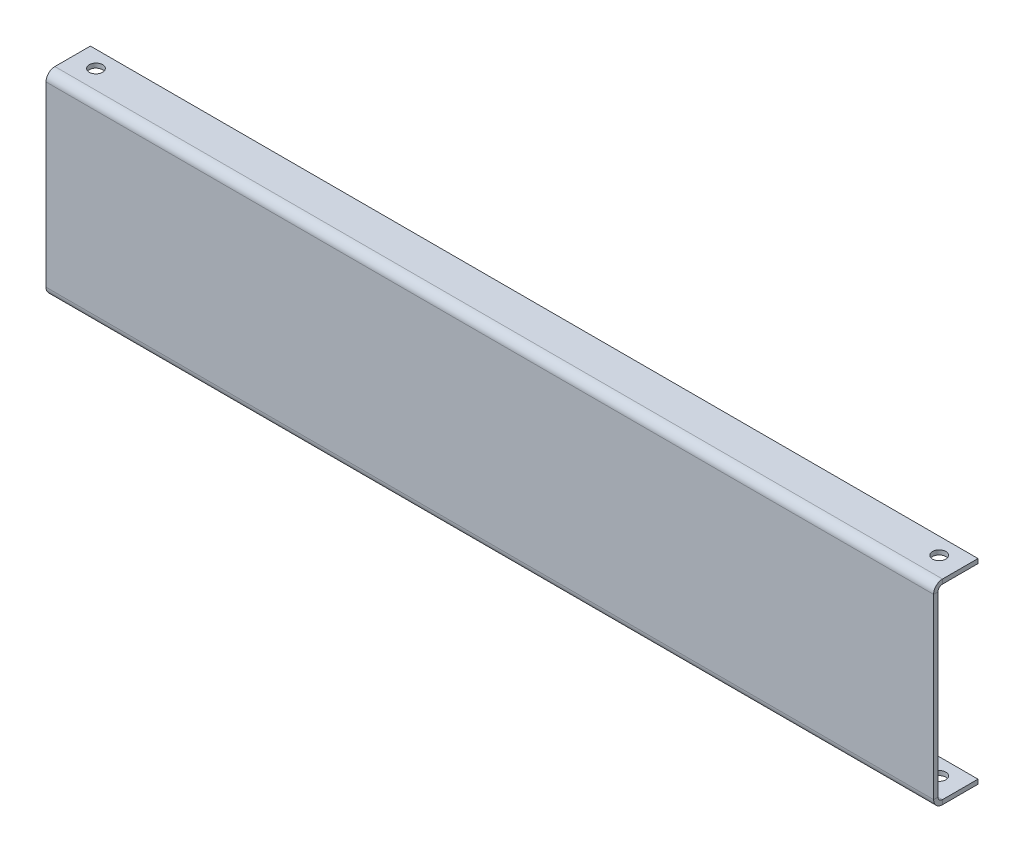
ISO-10303-21;
HEADER;
FILE_DESCRIPTION(('STEP AP214'),'2;1');
FILE_NAME('part.step','',(''),(''),'','','');
FILE_SCHEMA(('AUTOMOTIVE_DESIGN { 1 0 10303 214 1 1 1 1 }'));
ENDSEC;
DATA;
#1=APPLICATION_CONTEXT('core data for automotive mechanical design processes');
#2=APPLICATION_PROTOCOL_DEFINITION('international standard','automotive_design',2000,#1);
#3=PRODUCT_CONTEXT('',#1,'mechanical');
#4=PRODUCT('Part','Part','',(#3));
#5=PRODUCT_RELATED_PRODUCT_CATEGORY('part','',(#4));
#6=PRODUCT_DEFINITION_FORMATION('','',#4);
#7=PRODUCT_DEFINITION_CONTEXT('part definition',#1,'design');
#8=PRODUCT_DEFINITION('design','',#6,#7);
#9=PRODUCT_DEFINITION_SHAPE('','',#8);
#10=(LENGTH_UNIT() NAMED_UNIT(*) SI_UNIT(.MILLI.,.METRE.));
#11=(NAMED_UNIT(*) PLANE_ANGLE_UNIT() SI_UNIT($,.RADIAN.));
#12=(NAMED_UNIT(*) SI_UNIT($,.STERADIAN.) SOLID_ANGLE_UNIT());
#13=UNCERTAINTY_MEASURE_WITH_UNIT(LENGTH_MEASURE(1.E-05),#10,'distance_accuracy_value','');
#14=(GEOMETRIC_REPRESENTATION_CONTEXT(3) GLOBAL_UNCERTAINTY_ASSIGNED_CONTEXT((#13)) GLOBAL_UNIT_ASSIGNED_CONTEXT((#10,
#11,#12)) REPRESENTATION_CONTEXT('',''));
#15=CARTESIAN_POINT('',(0.,0.,0.));
#16=DIRECTION('',(0.,0.,1.));
#17=DIRECTION('',(1.,0.,0.));
#18=AXIS2_PLACEMENT_3D('',#15,#16,#17);
#19=CARTESIAN_POINT('',(400.,0.,16.));
#20=DIRECTION('',(1.,0.,0.));
#21=DIRECTION('',(0.,0.,-1.));
#22=AXIS2_PLACEMENT_3D('',#19,#20,#21);
#23=PLANE('',#22);
#24=DIRECTION('',(0.,-1.,0.));
#25=VECTOR('',#24,1.);
#26=CARTESIAN_POINT('',(400.,0.,16.));
#27=LINE('',#26,#25);
#28=CARTESIAN_POINT('',(400.,0.,16.));
#29=VERTEX_POINT('',#28);
#30=CARTESIAN_POINT('',(400.,-2.,16.));
#31=VERTEX_POINT('',#30);
#32=EDGE_CURVE('E11',#29,#31,#27,.T.);
#33=ORIENTED_EDGE('',*,*,#32,.F.);
#34=CARTESIAN_POINT('',(400.,-4.,16.));
#35=DIRECTION('',(-1.,0.,0.));
#36=DIRECTION('',(0.,0.,1.));
#37=AXIS2_PLACEMENT_3D('',#34,#35,#36);
#38=CIRCLE('',#37,4.);
#39=CARTESIAN_POINT('',(400.,-4.,20.));
#40=VERTEX_POINT('',#39);
#41=EDGE_CURVE('E149',#29,#40,#38,.F.);
#42=ORIENTED_EDGE('',*,*,#41,.T.);
#43=DIRECTION('',(0.,0.,1.));
#44=VECTOR('',#43,1.);
#45=CARTESIAN_POINT('',(400.,-4.,18.));
#46=LINE('',#45,#44);
#47=CARTESIAN_POINT('',(400.,-4.,18.));
#48=VERTEX_POINT('',#47);
#49=EDGE_CURVE('E47',#48,#40,#46,.T.);
#50=ORIENTED_EDGE('',*,*,#49,.F.);
#51=CARTESIAN_POINT('',(400.,-4.,16.));
#52=DIRECTION('',(1.,0.,0.));
#53=DIRECTION('',(0.,0.,-1.));
#54=AXIS2_PLACEMENT_3D('',#51,#52,#53);
#55=CIRCLE('',#54,2.);
#56=EDGE_CURVE('E244',#31,#48,#55,.T.);
#57=ORIENTED_EDGE('',*,*,#56,.F.);
#58=EDGE_LOOP('',(#33,#42,#50,#57));
#59=FACE_BOUND('',#58,.T.);
#60=ADVANCED_FACE('F39',(#59),#23,.T.);
#61=CARTESIAN_POINT('',(400.,-4.,18.));
#62=DIRECTION('',(1.,0.,0.));
#63=DIRECTION('',(0.,0.,-1.));
#64=AXIS2_PLACEMENT_3D('',#61,#62,#63);
#65=PLANE('',#64);
#66=DIRECTION('',(0.,0.,1.));
#67=VECTOR('',#66,1.);
#68=CARTESIAN_POINT('',(400.,0.,0.));
#69=LINE('',#68,#67);
#70=CARTESIAN_POINT('',(400.,0.,0.));
#71=VERTEX_POINT('',#70);
#72=EDGE_CURVE('E154',#71,#29,#69,.T.);
#73=ORIENTED_EDGE('',*,*,#72,.T.);
#74=ORIENTED_EDGE('',*,*,#32,.T.);
#75=DIRECTION('',(0.,0.,1.));
#76=VECTOR('',#75,1.);
#77=CARTESIAN_POINT('',(400.,-2.,0.));
#78=LINE('',#77,#76);
#79=CARTESIAN_POINT('',(400.,-2.,0.));
#80=VERTEX_POINT('',#79);
#81=EDGE_CURVE('E257',#80,#31,#78,.T.);
#82=ORIENTED_EDGE('',*,*,#81,.F.);
#83=DIRECTION('',(0.,-1.,0.));
#84=VECTOR('',#83,1.);
#85=CARTESIAN_POINT('',(400.,0.,0.));
#86=LINE('',#85,#84);
#87=EDGE_CURVE('E259',#71,#80,#86,.T.);
#88=ORIENTED_EDGE('',*,*,#87,.F.);
#89=EDGE_LOOP('',(#73,#74,#82,#88));
#90=FACE_BOUND('',#89,.T.);
#91=ADVANCED_FACE('F270',(#90),#65,.T.);
#92=CARTESIAN_POINT('',(0.,-4.,20.));
#93=DIRECTION('',(-1.,0.,0.));
#94=DIRECTION('',(0.,0.,1.));
#95=AXIS2_PLACEMENT_3D('',#92,#93,#94);
#96=PLANE('',#95);
#97=DIRECTION('',(0.,0.,-1.));
#98=VECTOR('',#97,1.);
#99=CARTESIAN_POINT('',(0.,-4.,20.));
#100=LINE('',#99,#98);
#101=CARTESIAN_POINT('',(0.,-4.,20.));
#102=VERTEX_POINT('',#101);
#103=CARTESIAN_POINT('',(0.,-4.,18.));
#104=VERTEX_POINT('',#103);
#105=EDGE_CURVE('E147',#102,#104,#100,.T.);
#106=ORIENTED_EDGE('',*,*,#105,.F.);
#107=CARTESIAN_POINT('',(0.,-4.,16.));
#108=DIRECTION('',(-1.,0.,0.));
#109=DIRECTION('',(0.,0.,1.));
#110=AXIS2_PLACEMENT_3D('',#107,#108,#109);
#111=CIRCLE('',#110,4.);
#112=CARTESIAN_POINT('',(0.,0.,16.));
#113=VERTEX_POINT('',#112);
#114=EDGE_CURVE('E161',#113,#102,#111,.F.);
#115=ORIENTED_EDGE('',*,*,#114,.F.);
#116=DIRECTION('',(0.,1.,0.));
#117=VECTOR('',#116,1.);
#118=CARTESIAN_POINT('',(0.,-2.,16.));
#119=LINE('',#118,#117);
#120=CARTESIAN_POINT('',(0.,-2.,16.));
#121=VERTEX_POINT('',#120);
#122=EDGE_CURVE('E235',#121,#113,#119,.T.);
#123=ORIENTED_EDGE('',*,*,#122,.F.);
#124=CARTESIAN_POINT('',(0.,-4.,16.));
#125=DIRECTION('',(1.,0.,0.));
#126=DIRECTION('',(0.,0.,-1.));
#127=AXIS2_PLACEMENT_3D('',#124,#125,#126);
#128=CIRCLE('',#127,2.);
#129=EDGE_CURVE('E189',#121,#104,#128,.T.);
#130=ORIENTED_EDGE('',*,*,#129,.T.);
#131=EDGE_LOOP('',(#106,#115,#123,#130));
#132=FACE_BOUND('',#131,.T.);
#133=ADVANCED_FACE('F249',(#132),#96,.T.);
#134=CARTESIAN_POINT('',(0.,-2.,16.));
#135=DIRECTION('',(-1.,0.,0.));
#136=DIRECTION('',(0.,0.,1.));
#137=AXIS2_PLACEMENT_3D('',#134,#135,#136);
#138=PLANE('',#137);
#139=DIRECTION('',(0.,-1.,0.));
#140=VECTOR('',#139,1.);
#141=CARTESIAN_POINT('',(0.,0.,20.));
#142=LINE('',#141,#140);
#143=CARTESIAN_POINT('',(0.,-84.1,20.));
#144=VERTEX_POINT('',#143);
#145=EDGE_CURVE('E202',#102,#144,#142,.T.);
#146=ORIENTED_EDGE('',*,*,#145,.F.);
#147=ORIENTED_EDGE('',*,*,#105,.T.);
#148=DIRECTION('',(0.,-1.,0.));
#149=VECTOR('',#148,1.);
#150=CARTESIAN_POINT('',(0.,0.,18.));
#151=LINE('',#150,#149);
#152=CARTESIAN_POINT('',(0.,-84.1,18.));
#153=VERTEX_POINT('',#152);
#154=EDGE_CURVE('E187',#104,#153,#151,.T.);
#155=ORIENTED_EDGE('',*,*,#154,.T.);
#156=DIRECTION('',(0.,0.,1.));
#157=VECTOR('',#156,1.);
#158=CARTESIAN_POINT('',(0.,-84.1,18.));
#159=LINE('',#158,#157);
#160=EDGE_CURVE('E96',#153,#144,#159,.T.);
#161=ORIENTED_EDGE('',*,*,#160,.T.);
#162=EDGE_LOOP('',(#146,#147,#155,#161));
#163=FACE_BOUND('',#162,.T.);
#164=ADVANCED_FACE('F237',(#163),#138,.T.);
#165=CARTESIAN_POINT('',(400.,-84.1,20.));
#166=DIRECTION('',(1.,0.,0.));
#167=DIRECTION('',(0.,0.,-1.));
#168=AXIS2_PLACEMENT_3D('',#165,#166,#167);
#169=PLANE('',#168);
#170=DIRECTION('',(0.,0.,-1.));
#171=VECTOR('',#170,1.);
#172=CARTESIAN_POINT('',(400.,-84.1,20.));
#173=LINE('',#172,#171);
#174=CARTESIAN_POINT('',(400.,-84.1,20.));
#175=VERTEX_POINT('',#174);
#176=CARTESIAN_POINT('',(400.,-84.1,18.));
#177=VERTEX_POINT('',#176);
#178=EDGE_CURVE('E233',#175,#177,#173,.T.);
#179=ORIENTED_EDGE('',*,*,#178,.F.);
#180=CARTESIAN_POINT('',(400.,-84.1,16.));
#181=DIRECTION('',(-1.,0.,0.));
#182=DIRECTION('',(0.,0.,1.));
#183=AXIS2_PLACEMENT_3D('',#180,#181,#182);
#184=CIRCLE('',#183,4.);
#185=CARTESIAN_POINT('',(400.,-88.1,16.));
#186=VERTEX_POINT('',#185);
#187=EDGE_CURVE('E169',#175,#186,#184,.F.);
#188=ORIENTED_EDGE('',*,*,#187,.T.);
#189=DIRECTION('',(0.,-1.,0.));
#190=VECTOR('',#189,1.);
#191=CARTESIAN_POINT('',(400.,-86.1,16.));
#192=LINE('',#191,#190);
#193=CARTESIAN_POINT('',(400.,-86.1,16.));
#194=VERTEX_POINT('',#193);
#195=EDGE_CURVE('E55',#194,#186,#192,.T.);
#196=ORIENTED_EDGE('',*,*,#195,.F.);
#197=CARTESIAN_POINT('',(400.,-84.1,16.));
#198=DIRECTION('',(1.,0.,0.));
#199=DIRECTION('',(0.,0.,-1.));
#200=AXIS2_PLACEMENT_3D('',#197,#198,#199);
#201=CIRCLE('',#200,2.);
#202=EDGE_CURVE('E261',#177,#194,#201,.T.);
#203=ORIENTED_EDGE('',*,*,#202,.F.);
#204=EDGE_LOOP('',(#179,#188,#196,#203));
#205=FACE_BOUND('',#204,.T.);
#206=ADVANCED_FACE('F298',(#205),#169,.T.);
#207=CARTESIAN_POINT('',(400.,-86.1,16.));
#208=DIRECTION('',(1.,0.,0.));
#209=DIRECTION('',(0.,0.,-1.));
#210=AXIS2_PLACEMENT_3D('',#207,#208,#209);
#211=PLANE('',#210);
#212=DIRECTION('',(0.,-1.,0.));
#213=VECTOR('',#212,1.);
#214=CARTESIAN_POINT('',(400.,0.,20.));
#215=LINE('',#214,#213);
#216=EDGE_CURVE('E139',#40,#175,#215,.T.);
#217=ORIENTED_EDGE('',*,*,#216,.T.);
#218=ORIENTED_EDGE('',*,*,#178,.T.);
#219=DIRECTION('',(0.,-1.,0.));
#220=VECTOR('',#219,1.);
#221=CARTESIAN_POINT('',(400.,0.,18.));
#222=LINE('',#221,#220);
#223=EDGE_CURVE('E142',#48,#177,#222,.T.);
#224=ORIENTED_EDGE('',*,*,#223,.F.);
#225=ORIENTED_EDGE('',*,*,#49,.T.);
#226=EDGE_LOOP('',(#217,#218,#224,#225));
#227=FACE_BOUND('',#226,.T.);
#228=ADVANCED_FACE('F137',(#227),#211,.T.);
#229=CARTESIAN_POINT('',(0.,-88.1,16.));
#230=DIRECTION('',(-1.,0.,0.));
#231=DIRECTION('',(0.,0.,1.));
#232=AXIS2_PLACEMENT_3D('',#229,#230,#231);
#233=PLANE('',#232);
#234=DIRECTION('',(0.,1.,0.));
#235=VECTOR('',#234,1.);
#236=CARTESIAN_POINT('',(0.,-88.1,16.));
#237=LINE('',#236,#235);
#238=CARTESIAN_POINT('',(0.,-88.1,16.));
#239=VERTEX_POINT('',#238);
#240=CARTESIAN_POINT('',(0.,-86.1,16.));
#241=VERTEX_POINT('',#240);
#242=EDGE_CURVE('E103',#239,#241,#237,.T.);
#243=ORIENTED_EDGE('',*,*,#242,.F.);
#244=CARTESIAN_POINT('',(0.,-84.1,16.));
#245=DIRECTION('',(-1.,0.,0.));
#246=DIRECTION('',(0.,0.,1.));
#247=AXIS2_PLACEMENT_3D('',#244,#245,#246);
#248=CIRCLE('',#247,4.);
#249=EDGE_CURVE('E204',#144,#239,#248,.F.);
#250=ORIENTED_EDGE('',*,*,#249,.F.);
#251=ORIENTED_EDGE('',*,*,#160,.F.);
#252=CARTESIAN_POINT('',(0.,-84.1,16.));
#253=DIRECTION('',(1.,0.,0.));
#254=DIRECTION('',(0.,0.,-1.));
#255=AXIS2_PLACEMENT_3D('',#252,#253,#254);
#256=CIRCLE('',#255,2.);
#257=EDGE_CURVE('E185',#153,#241,#256,.T.);
#258=ORIENTED_EDGE('',*,*,#257,.T.);
#259=EDGE_LOOP('',(#243,#250,#251,#258));
#260=FACE_BOUND('',#259,.T.);
#261=ADVANCED_FACE('F304',(#260),#233,.T.);
#262=CARTESIAN_POINT('',(0.,-84.1,18.));
#263=DIRECTION('',(-1.,0.,0.));
#264=DIRECTION('',(0.,0.,1.));
#265=AXIS2_PLACEMENT_3D('',#262,#263,#264);
#266=PLANE('',#265);
#267=DIRECTION('',(0.,0.,-1.));
#268=VECTOR('',#267,1.);
#269=CARTESIAN_POINT('',(0.,-88.1,20.));
#270=LINE('',#269,#268);
#271=CARTESIAN_POINT('',(0.,-88.1,0.));
#272=VERTEX_POINT('',#271);
#273=EDGE_CURVE('E175',#239,#272,#270,.T.);
#274=ORIENTED_EDGE('',*,*,#273,.F.);
#275=ORIENTED_EDGE('',*,*,#242,.T.);
#276=DIRECTION('',(0.,0.,-1.));
#277=VECTOR('',#276,1.);
#278=CARTESIAN_POINT('',(0.,-86.1,20.));
#279=LINE('',#278,#277);
#280=CARTESIAN_POINT('',(0.,-86.1,0.));
#281=VERTEX_POINT('',#280);
#282=EDGE_CURVE('E182',#241,#281,#279,.T.);
#283=ORIENTED_EDGE('',*,*,#282,.T.);
#284=DIRECTION('',(0.,-1.,0.));
#285=VECTOR('',#284,1.);
#286=CARTESIAN_POINT('',(0.,-86.1,0.));
#287=LINE('',#286,#285);
#288=EDGE_CURVE('E178',#281,#272,#287,.T.);
#289=ORIENTED_EDGE('',*,*,#288,.T.);
#290=EDGE_LOOP('',(#274,#275,#283,#289));
#291=FACE_BOUND('',#290,.T.);
#292=ADVANCED_FACE('F307',(#291),#266,.T.);
#293=CARTESIAN_POINT('',(400.,-88.1,20.));
#294=DIRECTION('',(0.,1.,0.));
#295=DIRECTION('',(0.,0.,1.));
#296=AXIS2_PLACEMENT_3D('',#293,#294,#295);
#297=PLANE('',#296);
#298=CARTESIAN_POINT('',(10.,-88.1,7.49999999999999));
#299=DIRECTION('',(0.,1.,0.));
#300=DIRECTION('',(0.,0.,1.));
#301=AXIS2_PLACEMENT_3D('',#298,#299,#300);
#302=CIRCLE('',#301,3.);
#303=CARTESIAN_POINT('',(10.,-88.1,10.5));
#304=VERTEX_POINT('',#303);
#305=EDGE_CURVE('E593',#304,#304,#302,.T.);
#306=ORIENTED_EDGE('',*,*,#305,.T.);
#307=EDGE_LOOP('',(#306));
#308=FACE_BOUND('',#307,.T.);
#309=CARTESIAN_POINT('',(390.,-88.1,7.49999999999999));
#310=DIRECTION('',(0.,1.,0.));
#311=DIRECTION('',(0.,0.,1.));
#312=AXIS2_PLACEMENT_3D('',#309,#310,#311);
#313=CIRCLE('',#312,2.99999999999999);
#314=CARTESIAN_POINT('',(390.,-88.1,10.5));
#315=VERTEX_POINT('',#314);
#316=EDGE_CURVE('E581',#315,#315,#313,.T.);
#317=ORIENTED_EDGE('',*,*,#316,.T.);
#318=EDGE_LOOP('',(#317));
#319=FACE_BOUND('',#318,.T.);
#320=ORIENTED_EDGE('',*,*,#273,.T.);
#321=DIRECTION('',(-1.,0.,0.));
#322=VECTOR('',#321,1.);
#323=CARTESIAN_POINT('',(400.,-88.1,0.));
#324=LINE('',#323,#322);
#325=CARTESIAN_POINT('',(400.,-88.1,0.));
#326=VERTEX_POINT('',#325);
#327=EDGE_CURVE('E228',#326,#272,#324,.T.);
#328=ORIENTED_EDGE('',*,*,#327,.F.);
#329=DIRECTION('',(0.,0.,-1.));
#330=VECTOR('',#329,1.);
#331=CARTESIAN_POINT('',(400.,-88.1,20.));
#332=LINE('',#331,#330);
#333=EDGE_CURVE('E109',#186,#326,#332,.T.);
#334=ORIENTED_EDGE('',*,*,#333,.F.);
#335=DIRECTION('',(-1.,0.,0.));
#336=VECTOR('',#335,1.);
#337=CARTESIAN_POINT('',(400.,-88.1,16.));
#338=LINE('',#337,#336);
#339=EDGE_CURVE('E171',#186,#239,#338,.T.);
#340=ORIENTED_EDGE('',*,*,#339,.T.);
#341=EDGE_LOOP('',(#320,#328,#334,#340));
#342=FACE_BOUND('',#341,.T.);
#343=ADVANCED_FACE('F310',(#308,#319,#342),#297,.F.);
#344=CARTESIAN_POINT('',(400.,-86.1,0.));
#345=DIRECTION('',(0.,0.,-1.));
#346=DIRECTION('',(-1.,0.,0.));
#347=AXIS2_PLACEMENT_3D('',#344,#345,#346);
#348=PLANE('',#347);
#349=ORIENTED_EDGE('',*,*,#288,.F.);
#350=DIRECTION('',(-1.,0.,0.));
#351=VECTOR('',#350,1.);
#352=CARTESIAN_POINT('',(400.,-86.1,0.));
#353=LINE('',#352,#351);
#354=CARTESIAN_POINT('',(400.,-86.1,0.));
#355=VERTEX_POINT('',#354);
#356=EDGE_CURVE('E226',#355,#281,#353,.T.);
#357=ORIENTED_EDGE('',*,*,#356,.F.);
#358=DIRECTION('',(0.,-1.,0.));
#359=VECTOR('',#358,1.);
#360=CARTESIAN_POINT('',(400.,-86.1,0.));
#361=LINE('',#360,#359);
#362=EDGE_CURVE('E565',#355,#326,#361,.T.);
#363=ORIENTED_EDGE('',*,*,#362,.T.);
#364=ORIENTED_EDGE('',*,*,#327,.T.);
#365=EDGE_LOOP('',(#349,#357,#363,#364));
#366=FACE_BOUND('',#365,.T.);
#367=ADVANCED_FACE('F314',(#366),#348,.T.);
#368=CARTESIAN_POINT('',(400.,-86.1,20.));
#369=DIRECTION('',(0.,1.,0.));
#370=DIRECTION('',(0.,0.,1.));
#371=AXIS2_PLACEMENT_3D('',#368,#369,#370);
#372=PLANE('',#371);
#373=CARTESIAN_POINT('',(10.,-86.1,7.49999999999999));
#374=DIRECTION('',(0.,1.,0.));
#375=DIRECTION('',(0.,0.,1.));
#376=AXIS2_PLACEMENT_3D('',#373,#374,#375);
#377=CIRCLE('',#376,3.);
#378=CARTESIAN_POINT('',(10.,-86.1,10.5));
#379=VERTEX_POINT('',#378);
#380=EDGE_CURVE('E585',#379,#379,#377,.T.);
#381=ORIENTED_EDGE('',*,*,#380,.F.);
#382=EDGE_LOOP('',(#381));
#383=FACE_BOUND('',#382,.T.);
#384=CARTESIAN_POINT('',(390.,-86.1,7.49999999999999));
#385=DIRECTION('',(0.,1.,0.));
#386=DIRECTION('',(0.,0.,1.));
#387=AXIS2_PLACEMENT_3D('',#384,#385,#386);
#388=CIRCLE('',#387,2.99999999999999);
#389=CARTESIAN_POINT('',(390.,-86.1,10.5));
#390=VERTEX_POINT('',#389);
#391=EDGE_CURVE('E179',#390,#390,#388,.T.);
#392=ORIENTED_EDGE('',*,*,#391,.F.);
#393=EDGE_LOOP('',(#392));
#394=FACE_BOUND('',#393,.T.);
#395=ORIENTED_EDGE('',*,*,#282,.F.);
#396=DIRECTION('',(-1.,0.,0.));
#397=VECTOR('',#396,1.);
#398=CARTESIAN_POINT('',(400.,-86.1,16.));
#399=LINE('',#398,#397);
#400=EDGE_CURVE('E223',#194,#241,#399,.T.);
#401=ORIENTED_EDGE('',*,*,#400,.F.);
#402=DIRECTION('',(0.,0.,-1.));
#403=VECTOR('',#402,1.);
#404=CARTESIAN_POINT('',(400.,-86.1,20.));
#405=LINE('',#404,#403);
#406=EDGE_CURVE('E567',#194,#355,#405,.T.);
#407=ORIENTED_EDGE('',*,*,#406,.T.);
#408=ORIENTED_EDGE('',*,*,#356,.T.);
#409=EDGE_LOOP('',(#395,#401,#407,#408));
#410=FACE_BOUND('',#409,.T.);
#411=ADVANCED_FACE('F318',(#383,#394,#410),#372,.T.);
#412=CARTESIAN_POINT('',(400.,-84.1,16.));
#413=DIRECTION('',(-1.,0.,0.));
#414=DIRECTION('',(0.,0.,1.));
#415=AXIS2_PLACEMENT_3D('',#412,#413,#414);
#416=CYLINDRICAL_SURFACE('',#415,2.);
#417=ORIENTED_EDGE('',*,*,#257,.F.);
#418=DIRECTION('',(-1.,0.,0.));
#419=VECTOR('',#418,1.);
#420=CARTESIAN_POINT('',(400.,-84.1,18.));
#421=LINE('',#420,#419);
#422=EDGE_CURVE('E220',#177,#153,#421,.T.);
#423=ORIENTED_EDGE('',*,*,#422,.F.);
#424=ORIENTED_EDGE('',*,*,#202,.T.);
#425=ORIENTED_EDGE('',*,*,#400,.T.);
#426=EDGE_LOOP('',(#417,#423,#424,#425));
#427=FACE_BOUND('',#426,.T.);
#428=ADVANCED_FACE('F322',(#427),#416,.F.);
#429=CARTESIAN_POINT('',(400.,0.,18.));
#430=DIRECTION('',(0.,0.,-1.));
#431=DIRECTION('',(0.,1.,0.));
#432=AXIS2_PLACEMENT_3D('',#429,#430,#431);
#433=PLANE('',#432);
#434=ORIENTED_EDGE('',*,*,#154,.F.);
#435=DIRECTION('',(-1.,0.,0.));
#436=VECTOR('',#435,1.);
#437=CARTESIAN_POINT('',(400.,-4.,18.));
#438=LINE('',#437,#436);
#439=EDGE_CURVE('E217',#48,#104,#438,.T.);
#440=ORIENTED_EDGE('',*,*,#439,.F.);
#441=ORIENTED_EDGE('',*,*,#223,.T.);
#442=ORIENTED_EDGE('',*,*,#422,.T.);
#443=EDGE_LOOP('',(#434,#440,#441,#442));
#444=FACE_BOUND('',#443,.T.);
#445=ADVANCED_FACE('F246',(#444),#433,.T.);
#446=CARTESIAN_POINT('',(400.,-4.,16.));
#447=DIRECTION('',(-1.,0.,0.));
#448=DIRECTION('',(0.,0.,1.));
#449=AXIS2_PLACEMENT_3D('',#446,#447,#448);
#450=CYLINDRICAL_SURFACE('',#449,2.);
#451=ORIENTED_EDGE('',*,*,#129,.F.);
#452=DIRECTION('',(-1.,0.,0.));
#453=VECTOR('',#452,1.);
#454=CARTESIAN_POINT('',(400.,-2.,16.));
#455=LINE('',#454,#453);
#456=EDGE_CURVE('E214',#31,#121,#455,.T.);
#457=ORIENTED_EDGE('',*,*,#456,.F.);
#458=ORIENTED_EDGE('',*,*,#56,.T.);
#459=ORIENTED_EDGE('',*,*,#439,.T.);
#460=EDGE_LOOP('',(#451,#457,#458,#459));
#461=FACE_BOUND('',#460,.T.);
#462=ADVANCED_FACE('F242',(#461),#450,.F.);
#463=CARTESIAN_POINT('',(400.,-2.,0.));
#464=DIRECTION('',(0.,-1.,0.));
#465=DIRECTION('',(0.,0.,-1.));
#466=AXIS2_PLACEMENT_3D('',#463,#464,#465);
#467=PLANE('',#466);
#468=CARTESIAN_POINT('',(10.,-2.,7.5));
#469=DIRECTION('',(0.,-1.,0.));
#470=DIRECTION('',(0.,0.,-1.));
#471=AXIS2_PLACEMENT_3D('',#468,#469,#470);
#472=CIRCLE('',#471,3.);
#473=CARTESIAN_POINT('',(10.,-2.,4.5));
#474=VERTEX_POINT('',#473);
#475=EDGE_CURVE('E590',#474,#474,#472,.T.);
#476=ORIENTED_EDGE('',*,*,#475,.F.);
#477=EDGE_LOOP('',(#476));
#478=FACE_BOUND('',#477,.T.);
#479=CARTESIAN_POINT('',(390.,-2.,7.5));
#480=DIRECTION('',(0.,-1.,0.));
#481=DIRECTION('',(0.,0.,-1.));
#482=AXIS2_PLACEMENT_3D('',#479,#480,#481);
#483=CIRCLE('',#482,2.99999999999999);
#484=CARTESIAN_POINT('',(390.,-2.,4.50000000000001));
#485=VERTEX_POINT('',#484);
#486=EDGE_CURVE('E578',#485,#485,#483,.T.);
#487=ORIENTED_EDGE('',*,*,#486,.F.);
#488=EDGE_LOOP('',(#487));
#489=FACE_BOUND('',#488,.T.);
#490=DIRECTION('',(0.,0.,1.));
#491=VECTOR('',#490,1.);
#492=CARTESIAN_POINT('',(0.,-2.,0.));
#493=LINE('',#492,#491);
#494=CARTESIAN_POINT('',(0.,-2.,0.));
#495=VERTEX_POINT('',#494);
#496=EDGE_CURVE('E192',#495,#121,#493,.T.);
#497=ORIENTED_EDGE('',*,*,#496,.F.);
#498=DIRECTION('',(-1.,0.,0.));
#499=VECTOR('',#498,1.);
#500=CARTESIAN_POINT('',(400.,-2.,0.));
#501=LINE('',#500,#499);
#502=EDGE_CURVE('E212',#80,#495,#501,.T.);
#503=ORIENTED_EDGE('',*,*,#502,.F.);
#504=ORIENTED_EDGE('',*,*,#81,.T.);
#505=ORIENTED_EDGE('',*,*,#456,.T.);
#506=EDGE_LOOP('',(#497,#503,#504,#505));
#507=FACE_BOUND('',#506,.T.);
#508=ADVANCED_FACE('F255',(#478,#489,#507),#467,.T.);
#509=CARTESIAN_POINT('',(400.,0.,0.));
#510=DIRECTION('',(0.,0.,-1.));
#511=DIRECTION('',(0.,1.,0.));
#512=AXIS2_PLACEMENT_3D('',#509,#510,#511);
#513=PLANE('',#512);
#514=DIRECTION('',(0.,-1.,0.));
#515=VECTOR('',#514,1.);
#516=CARTESIAN_POINT('',(0.,0.,0.));
#517=LINE('',#516,#515);
#518=CARTESIAN_POINT('',(0.,0.,0.));
#519=VERTEX_POINT('',#518);
#520=EDGE_CURVE('E195',#519,#495,#517,.T.);
#521=ORIENTED_EDGE('',*,*,#520,.F.);
#522=DIRECTION('',(-1.,0.,0.));
#523=VECTOR('',#522,1.);
#524=CARTESIAN_POINT('',(400.,0.,0.));
#525=LINE('',#524,#523);
#526=EDGE_CURVE('E210',#71,#519,#525,.T.);
#527=ORIENTED_EDGE('',*,*,#526,.F.);
#528=ORIENTED_EDGE('',*,*,#87,.T.);
#529=ORIENTED_EDGE('',*,*,#502,.T.);
#530=EDGE_LOOP('',(#521,#527,#528,#529));
#531=FACE_BOUND('',#530,.T.);
#532=ADVANCED_FACE('F276',(#531),#513,.T.);
#533=CARTESIAN_POINT('',(400.,0.,0.));
#534=DIRECTION('',(0.,-1.,0.));
#535=DIRECTION('',(0.,0.,-1.));
#536=AXIS2_PLACEMENT_3D('',#533,#534,#535);
#537=PLANE('',#536);
#538=CARTESIAN_POINT('',(10.,0.,7.5));
#539=DIRECTION('',(0.,1.,0.));
#540=DIRECTION('',(0.,0.,1.));
#541=AXIS2_PLACEMENT_3D('',#538,#539,#540);
#542=CIRCLE('',#541,3.);
#543=CARTESIAN_POINT('',(10.,0.,10.5));
#544=VERTEX_POINT('',#543);
#545=EDGE_CURVE('E594',#544,#544,#542,.T.);
#546=ORIENTED_EDGE('',*,*,#545,.F.);
#547=EDGE_LOOP('',(#546));
#548=FACE_BOUND('',#547,.T.);
#549=CARTESIAN_POINT('',(390.,0.,7.5));
#550=DIRECTION('',(0.,1.,0.));
#551=DIRECTION('',(0.,0.,1.));
#552=AXIS2_PLACEMENT_3D('',#549,#550,#551);
#553=CIRCLE('',#552,2.99999999999999);
#554=CARTESIAN_POINT('',(390.,0.,10.5));
#555=VERTEX_POINT('',#554);
#556=EDGE_CURVE('E582',#555,#555,#553,.T.);
#557=ORIENTED_EDGE('',*,*,#556,.F.);
#558=EDGE_LOOP('',(#557));
#559=FACE_BOUND('',#558,.T.);
#560=DIRECTION('',(0.,0.,1.));
#561=VECTOR('',#560,1.);
#562=CARTESIAN_POINT('',(0.,0.,0.));
#563=LINE('',#562,#561);
#564=EDGE_CURVE('E198',#519,#113,#563,.T.);
#565=ORIENTED_EDGE('',*,*,#564,.T.);
#566=DIRECTION('',(-1.,0.,0.));
#567=VECTOR('',#566,1.);
#568=CARTESIAN_POINT('',(400.,0.,16.));
#569=LINE('',#568,#567);
#570=EDGE_CURVE('E163',#29,#113,#569,.T.);
#571=ORIENTED_EDGE('',*,*,#570,.F.);
#572=ORIENTED_EDGE('',*,*,#72,.F.);
#573=ORIENTED_EDGE('',*,*,#526,.T.);
#574=EDGE_LOOP('',(#565,#571,#572,#573));
#575=FACE_BOUND('',#574,.T.);
#576=ADVANCED_FACE('F272',(#548,#559,#575),#537,.F.);
#577=CARTESIAN_POINT('',(400.,-4.,16.));
#578=DIRECTION('',(-1.,0.,0.));
#579=DIRECTION('',(0.,0.,1.));
#580=AXIS2_PLACEMENT_3D('',#577,#578,#579);
#581=CYLINDRICAL_SURFACE('',#580,4.);
#582=ORIENTED_EDGE('',*,*,#114,.T.);
#583=DIRECTION('',(-1.,0.,0.));
#584=VECTOR('',#583,1.);
#585=CARTESIAN_POINT('',(400.,-4.,20.));
#586=LINE('',#585,#584);
#587=EDGE_CURVE('E158',#40,#102,#586,.T.);
#588=ORIENTED_EDGE('',*,*,#587,.F.);
#589=ORIENTED_EDGE('',*,*,#41,.F.);
#590=ORIENTED_EDGE('',*,*,#570,.T.);
#591=EDGE_LOOP('',(#582,#588,#589,#590));
#592=FACE_BOUND('',#591,.T.);
#593=ADVANCED_FACE('F159',(#592),#581,.T.);
#594=CARTESIAN_POINT('',(400.,0.,20.));
#595=DIRECTION('',(0.,0.,-1.));
#596=DIRECTION('',(0.,1.,0.));
#597=AXIS2_PLACEMENT_3D('',#594,#595,#596);
#598=PLANE('',#597);
#599=ORIENTED_EDGE('',*,*,#145,.T.);
#600=DIRECTION('',(-1.,0.,0.));
#601=VECTOR('',#600,1.);
#602=CARTESIAN_POINT('',(400.,-84.1,20.));
#603=LINE('',#602,#601);
#604=EDGE_CURVE('E164',#175,#144,#603,.T.);
#605=ORIENTED_EDGE('',*,*,#604,.F.);
#606=ORIENTED_EDGE('',*,*,#216,.F.);
#607=ORIENTED_EDGE('',*,*,#587,.T.);
#608=EDGE_LOOP('',(#599,#605,#606,#607));
#609=FACE_BOUND('',#608,.T.);
#610=ADVANCED_FACE('F166',(#609),#598,.F.);
#611=CARTESIAN_POINT('',(400.,-84.1,16.));
#612=DIRECTION('',(-1.,0.,0.));
#613=DIRECTION('',(0.,0.,1.));
#614=AXIS2_PLACEMENT_3D('',#611,#612,#613);
#615=CYLINDRICAL_SURFACE('',#614,4.);
#616=ORIENTED_EDGE('',*,*,#249,.T.);
#617=ORIENTED_EDGE('',*,*,#339,.F.);
#618=ORIENTED_EDGE('',*,*,#187,.F.);
#619=ORIENTED_EDGE('',*,*,#604,.T.);
#620=EDGE_LOOP('',(#616,#617,#618,#619));
#621=FACE_BOUND('',#620,.T.);
#622=ADVANCED_FACE('F451',(#621),#615,.T.);
#623=CARTESIAN_POINT('',(400.,-84.1,16.));
#624=DIRECTION('',(1.,0.,0.));
#625=DIRECTION('',(0.,0.,-1.));
#626=AXIS2_PLACEMENT_3D('',#623,#624,#625);
#627=PLANE('',#626);
#628=ORIENTED_EDGE('',*,*,#333,.T.);
#629=ORIENTED_EDGE('',*,*,#362,.F.);
#630=ORIENTED_EDGE('',*,*,#406,.F.);
#631=ORIENTED_EDGE('',*,*,#195,.T.);
#632=EDGE_LOOP('',(#628,#629,#630,#631));
#633=FACE_BOUND('',#632,.T.);
#634=ADVANCED_FACE('F456',(#633),#627,.T.);
#635=CARTESIAN_POINT('',(0.,-84.1,16.));
#636=DIRECTION('',(1.,0.,0.));
#637=DIRECTION('',(0.,0.,-1.));
#638=AXIS2_PLACEMENT_3D('',#635,#636,#637);
#639=PLANE('',#638);
#640=ORIENTED_EDGE('',*,*,#496,.T.);
#641=ORIENTED_EDGE('',*,*,#122,.T.);
#642=ORIENTED_EDGE('',*,*,#564,.F.);
#643=ORIENTED_EDGE('',*,*,#520,.T.);
#644=EDGE_LOOP('',(#640,#641,#642,#643));
#645=FACE_BOUND('',#644,.T.);
#646=ADVANCED_FACE('F274',(#645),#639,.F.);
#647=CARTESIAN_POINT('',(390.,-88.1,7.49999999999999));
#648=DIRECTION('',(0.,1.,0.));
#649=DIRECTION('',(0.,0.,1.));
#650=AXIS2_PLACEMENT_3D('',#647,#648,#649);
#651=CYLINDRICAL_SURFACE('',#650,2.99999999999999);
#652=ORIENTED_EDGE('',*,*,#486,.T.);
#653=EDGE_LOOP('',(#652));
#654=FACE_BOUND('',#653,.T.);
#655=ORIENTED_EDGE('',*,*,#556,.T.);
#656=EDGE_LOOP('',(#655));
#657=FACE_BOUND('',#656,.T.);
#658=ADVANCED_FACE('F358',(#654,#657),#651,.F.);
#659=ORIENTED_EDGE('',*,*,#391,.T.);
#660=EDGE_LOOP('',(#659));
#661=FACE_BOUND('',#660,.T.);
#662=ORIENTED_EDGE('',*,*,#316,.F.);
#663=EDGE_LOOP('',(#662));
#664=FACE_BOUND('',#663,.T.);
#665=ADVANCED_FACE('F363',(#661,#664),#651,.F.);
#666=CARTESIAN_POINT('',(10.,-88.1,7.49999999999999));
#667=DIRECTION('',(0.,1.,0.));
#668=DIRECTION('',(0.,0.,1.));
#669=AXIS2_PLACEMENT_3D('',#666,#667,#668);
#670=CYLINDRICAL_SURFACE('',#669,3.);
#671=ORIENTED_EDGE('',*,*,#475,.T.);
#672=EDGE_LOOP('',(#671));
#673=FACE_BOUND('',#672,.T.);
#674=ORIENTED_EDGE('',*,*,#545,.T.);
#675=EDGE_LOOP('',(#674));
#676=FACE_BOUND('',#675,.T.);
#677=ADVANCED_FACE('F376',(#673,#676),#670,.F.);
#678=ORIENTED_EDGE('',*,*,#380,.T.);
#679=EDGE_LOOP('',(#678));
#680=FACE_BOUND('',#679,.T.);
#681=ORIENTED_EDGE('',*,*,#305,.F.);
#682=EDGE_LOOP('',(#681));
#683=FACE_BOUND('',#682,.T.);
#684=ADVANCED_FACE('F386',(#680,#683),#670,.F.);
#685=CLOSED_SHELL('',(#60,#91,#133,#164,#206,#228,#261,#292,#343,#367,#411,#428,#445,#462,#508,
#532,#576,#593,#610,#622,#634,#646,#658,#665,#677,#684));
#686=MANIFOLD_SOLID_BREP('B2',#685);
#687=ADVANCED_BREP_SHAPE_REPRESENTATION('',(#18,#686),#14);
#688=SHAPE_DEFINITION_REPRESENTATION(#9,#687);
ENDSEC;
END-ISO-10303-21;
